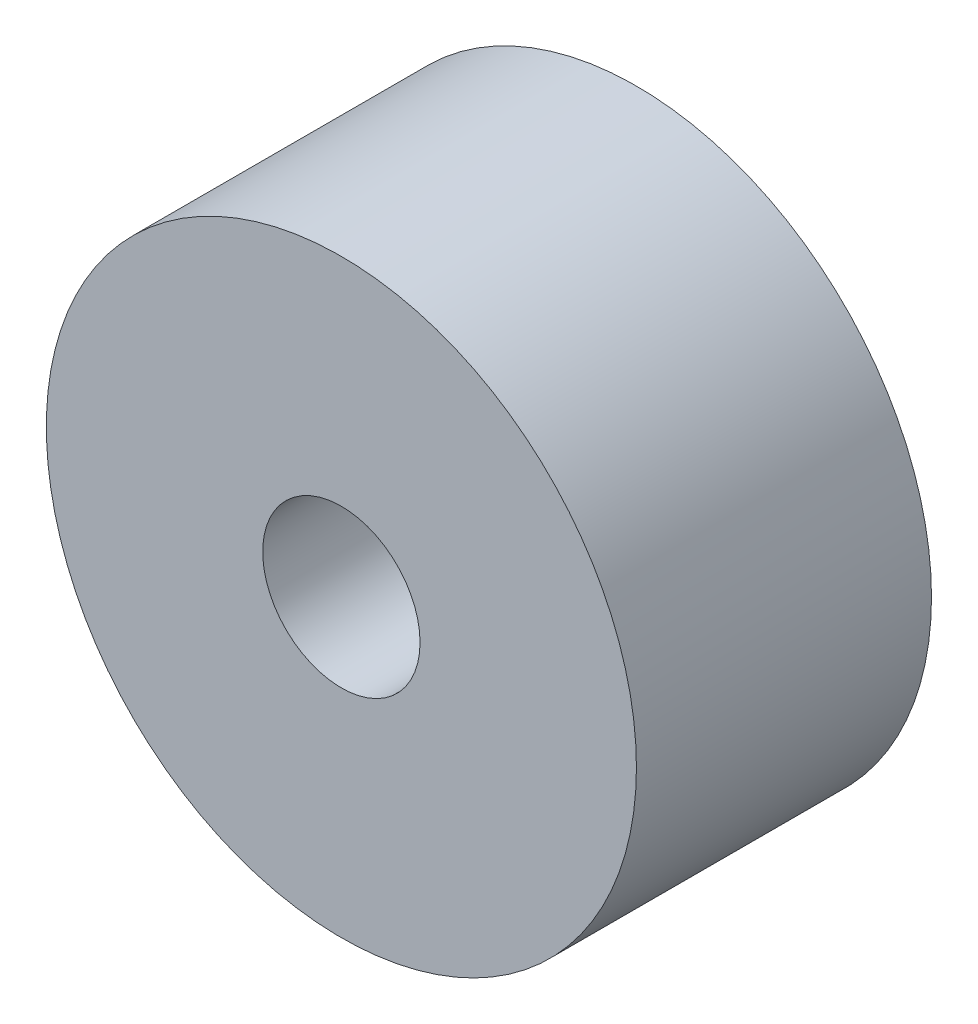
ISO-10303-21;
HEADER;
FILE_DESCRIPTION(('STEP AP214'),'2;1');
FILE_NAME('part.step','',(''),(''),'','','');
FILE_SCHEMA(('AUTOMOTIVE_DESIGN { 1 0 10303 214 1 1 1 1 }'));
ENDSEC;
DATA;
#1=APPLICATION_CONTEXT('core data for automotive mechanical design processes');
#2=APPLICATION_PROTOCOL_DEFINITION('international standard','automotive_design',2000,#1);
#3=PRODUCT_CONTEXT('',#1,'mechanical');
#4=PRODUCT('Part','Part','',(#3));
#5=PRODUCT_RELATED_PRODUCT_CATEGORY('part','',(#4));
#6=PRODUCT_DEFINITION_FORMATION('','',#4);
#7=PRODUCT_DEFINITION_CONTEXT('part definition',#1,'design');
#8=PRODUCT_DEFINITION('design','',#6,#7);
#9=PRODUCT_DEFINITION_SHAPE('','',#8);
#10=(LENGTH_UNIT() NAMED_UNIT(*) SI_UNIT(.MILLI.,.METRE.));
#11=(NAMED_UNIT(*) PLANE_ANGLE_UNIT() SI_UNIT($,.RADIAN.));
#12=(NAMED_UNIT(*) SI_UNIT($,.STERADIAN.) SOLID_ANGLE_UNIT());
#13=UNCERTAINTY_MEASURE_WITH_UNIT(LENGTH_MEASURE(1.E-05),#10,'distance_accuracy_value','');
#14=(GEOMETRIC_REPRESENTATION_CONTEXT(3) GLOBAL_UNCERTAINTY_ASSIGNED_CONTEXT((#13)) GLOBAL_UNIT_ASSIGNED_CONTEXT((#10,
#11,#12)) REPRESENTATION_CONTEXT('',''));
#15=CARTESIAN_POINT('',(0.,0.,0.));
#16=DIRECTION('',(0.,0.,1.));
#17=DIRECTION('',(1.,0.,0.));
#18=AXIS2_PLACEMENT_3D('',#15,#16,#17);
#19=CARTESIAN_POINT('',(0.,0.,30.));
#20=DIRECTION('',(0.,0.,1.));
#21=DIRECTION('',(1.,0.,0.));
#22=AXIS2_PLACEMENT_3D('',#19,#20,#21);
#23=PLANE('',#22);
#24=CARTESIAN_POINT('',(0.,0.,30.));
#25=DIRECTION('',(0.,0.,1.));
#26=DIRECTION('',(1.,0.,0.));
#27=AXIS2_PLACEMENT_3D('',#24,#25,#26);
#28=CIRCLE('',#27,30.);
#29=CARTESIAN_POINT('',(30.,0.,30.));
#30=VERTEX_POINT('',#29);
#31=EDGE_CURVE('E10',#30,#30,#28,.T.);
#32=ORIENTED_EDGE('',*,*,#31,.T.);
#33=EDGE_LOOP('',(#32));
#34=FACE_BOUND('',#33,.T.);
#35=CARTESIAN_POINT('',(0.,0.,30.));
#36=DIRECTION('',(0.,0.,1.));
#37=DIRECTION('',(1.,0.,0.));
#38=AXIS2_PLACEMENT_3D('',#35,#36,#37);
#39=CIRCLE('',#38,8.);
#40=CARTESIAN_POINT('',(8.,0.,30.));
#41=VERTEX_POINT('',#40);
#42=EDGE_CURVE('E52',#41,#41,#39,.T.);
#43=ORIENTED_EDGE('',*,*,#42,.F.);
#44=EDGE_LOOP('',(#43));
#45=FACE_BOUND('',#44,.T.);
#46=ADVANCED_FACE('F45',(#34,#45),#23,.T.);
#47=CARTESIAN_POINT('',(0.,0.,0.));
#48=DIRECTION('',(0.,0.,1.));
#49=DIRECTION('',(1.,0.,0.));
#50=AXIS2_PLACEMENT_3D('',#47,#48,#49);
#51=PLANE('',#50);
#52=CARTESIAN_POINT('',(0.,0.,0.));
#53=DIRECTION('',(0.,0.,1.));
#54=DIRECTION('',(1.,0.,0.));
#55=AXIS2_PLACEMENT_3D('',#52,#53,#54);
#56=CIRCLE('',#55,30.);
#57=CARTESIAN_POINT('',(30.,0.,0.));
#58=VERTEX_POINT('',#57);
#59=EDGE_CURVE('E46',#58,#58,#56,.T.);
#60=ORIENTED_EDGE('',*,*,#59,.F.);
#61=EDGE_LOOP('',(#60));
#62=FACE_BOUND('',#61,.T.);
#63=CARTESIAN_POINT('',(0.,0.,0.));
#64=DIRECTION('',(0.,0.,1.));
#65=DIRECTION('',(1.,0.,0.));
#66=AXIS2_PLACEMENT_3D('',#63,#64,#65);
#67=CIRCLE('',#66,8.);
#68=CARTESIAN_POINT('',(8.,0.,0.));
#69=VERTEX_POINT('',#68);
#70=EDGE_CURVE('E54',#69,#69,#67,.T.);
#71=ORIENTED_EDGE('',*,*,#70,.T.);
#72=EDGE_LOOP('',(#71));
#73=FACE_BOUND('',#72,.T.);
#74=ADVANCED_FACE('F61',(#62,#73),#51,.F.);
#75=CARTESIAN_POINT('',(0.,0.,30.));
#76=DIRECTION('',(0.,0.,-1.));
#77=DIRECTION('',(-1.,0.,0.));
#78=AXIS2_PLACEMENT_3D('',#75,#76,#77);
#79=CYLINDRICAL_SURFACE('',#78,30.);
#80=ORIENTED_EDGE('',*,*,#31,.F.);
#81=EDGE_LOOP('',(#80));
#82=FACE_BOUND('',#81,.T.);
#83=ORIENTED_EDGE('',*,*,#59,.T.);
#84=EDGE_LOOP('',(#83));
#85=FACE_BOUND('',#84,.T.);
#86=ADVANCED_FACE('F42',(#82,#85),#79,.T.);
#87=CARTESIAN_POINT('',(0.,0.,30.));
#88=DIRECTION('',(0.,0.,-1.));
#89=DIRECTION('',(-1.,0.,0.));
#90=AXIS2_PLACEMENT_3D('',#87,#88,#89);
#91=CYLINDRICAL_SURFACE('',#90,8.);
#92=ORIENTED_EDGE('',*,*,#42,.T.);
#93=EDGE_LOOP('',(#92));
#94=FACE_BOUND('',#93,.T.);
#95=ORIENTED_EDGE('',*,*,#70,.F.);
#96=EDGE_LOOP('',(#95));
#97=FACE_BOUND('',#96,.T.);
#98=ADVANCED_FACE('F63',(#94,#97),#91,.F.);
#99=CLOSED_SHELL('',(#46,#74,#86,#98));
#100=MANIFOLD_SOLID_BREP('B2',#99);
#101=ADVANCED_BREP_SHAPE_REPRESENTATION('',(#18,#100),#14);
#102=SHAPE_DEFINITION_REPRESENTATION(#9,#101);
ENDSEC;
END-ISO-10303-21;
